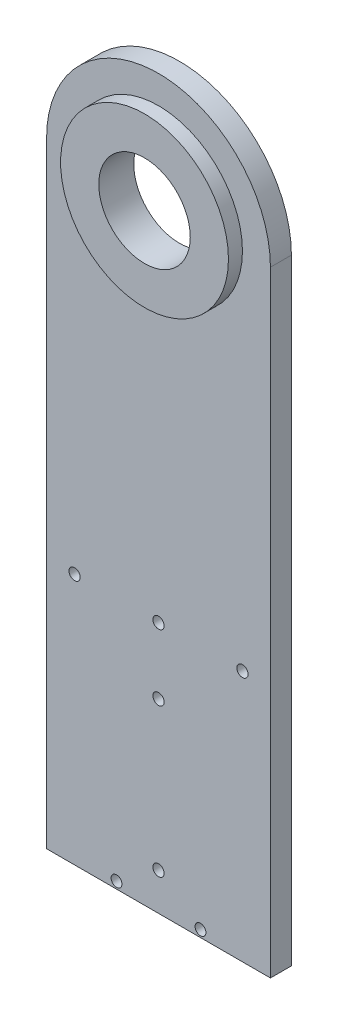
ISO-10303-21;
HEADER;
FILE_DESCRIPTION(('STEP AP214'),'2;1');
FILE_NAME('part.step','',(''),(''),'','','');
FILE_SCHEMA(('AUTOMOTIVE_DESIGN { 1 0 10303 214 1 1 1 1 }'));
ENDSEC;
DATA;
#1=APPLICATION_CONTEXT('core data for automotive mechanical design processes');
#2=APPLICATION_PROTOCOL_DEFINITION('international standard','automotive_design',2000,#1);
#3=PRODUCT_CONTEXT('',#1,'mechanical');
#4=PRODUCT('Part','Part','',(#3));
#5=PRODUCT_RELATED_PRODUCT_CATEGORY('part','',(#4));
#6=PRODUCT_DEFINITION_FORMATION('','',#4);
#7=PRODUCT_DEFINITION_CONTEXT('part definition',#1,'design');
#8=PRODUCT_DEFINITION('design','',#6,#7);
#9=PRODUCT_DEFINITION_SHAPE('','',#8);
#10=(LENGTH_UNIT() NAMED_UNIT(*) SI_UNIT(.MILLI.,.METRE.));
#11=(NAMED_UNIT(*) PLANE_ANGLE_UNIT() SI_UNIT($,.RADIAN.));
#12=(NAMED_UNIT(*) SI_UNIT($,.STERADIAN.) SOLID_ANGLE_UNIT());
#13=UNCERTAINTY_MEASURE_WITH_UNIT(LENGTH_MEASURE(1.E-05),#10,'distance_accuracy_value','');
#14=(GEOMETRIC_REPRESENTATION_CONTEXT(3) GLOBAL_UNCERTAINTY_ASSIGNED_CONTEXT((#13)) GLOBAL_UNIT_ASSIGNED_CONTEXT((#10,
#11,#12)) REPRESENTATION_CONTEXT('',''));
#15=CARTESIAN_POINT('',(0.,0.,0.));
#16=DIRECTION('',(0.,0.,1.));
#17=DIRECTION('',(1.,0.,0.));
#18=AXIS2_PLACEMENT_3D('',#15,#16,#17);
#19=CARTESIAN_POINT('',(0.,279.4,9.525));
#20=DIRECTION('',(0.,0.,1.));
#21=DIRECTION('',(1.,0.,0.));
#22=AXIS2_PLACEMENT_3D('',#19,#20,#21);
#23=PLANE('',#22);
#24=CARTESIAN_POINT('',(0.,84.30006,9.525));
#25=DIRECTION('',(0.,0.,1.));
#26=DIRECTION('',(1.,0.,0.));
#27=AXIS2_PLACEMENT_3D('',#24,#25,#26);
#28=CIRCLE('',#27,2.55269999999999);
#29=CARTESIAN_POINT('',(2.55269999999999,84.30006,9.525));
#30=VERTEX_POINT('',#29);
#31=EDGE_CURVE('E157',#30,#30,#28,.T.);
#32=ORIENTED_EDGE('',*,*,#31,.F.);
#33=EDGE_LOOP('',(#32));
#34=FACE_BOUND('',#33,.T.);
#35=CARTESIAN_POINT('',(0.,16.99006,9.525));
#36=DIRECTION('',(0.,0.,1.));
#37=DIRECTION('',(1.,0.,0.));
#38=AXIS2_PLACEMENT_3D('',#35,#36,#37);
#39=CIRCLE('',#38,2.55269999999999);
#40=CARTESIAN_POINT('',(2.55269999999999,16.99006,9.525));
#41=VERTEX_POINT('',#40);
#42=EDGE_CURVE('E151',#41,#41,#39,.T.);
#43=ORIENTED_EDGE('',*,*,#42,.F.);
#44=EDGE_LOOP('',(#43));
#45=FACE_BOUND('',#44,.T.);
#46=CARTESIAN_POINT('',(38.1,114.3,9.525));
#47=DIRECTION('',(0.,0.,1.));
#48=DIRECTION('',(1.,0.,0.));
#49=AXIS2_PLACEMENT_3D('',#46,#47,#48);
#50=CIRCLE('',#49,2.55269999999999);
#51=CARTESIAN_POINT('',(40.6527,114.3,9.525));
#52=VERTEX_POINT('',#51);
#53=EDGE_CURVE('E145',#52,#52,#50,.T.);
#54=ORIENTED_EDGE('',*,*,#53,.F.);
#55=EDGE_LOOP('',(#54));
#56=FACE_BOUND('',#55,.T.);
#57=CARTESIAN_POINT('',(0.,114.3,9.525));
#58=DIRECTION('',(0.,0.,1.));
#59=DIRECTION('',(1.,0.,0.));
#60=AXIS2_PLACEMENT_3D('',#57,#58,#59);
#61=CIRCLE('',#60,2.55269999999999);
#62=CARTESIAN_POINT('',(2.55269999999999,114.3,9.525));
#63=VERTEX_POINT('',#62);
#64=EDGE_CURVE('E139',#63,#63,#61,.T.);
#65=ORIENTED_EDGE('',*,*,#64,.F.);
#66=EDGE_LOOP('',(#65));
#67=FACE_BOUND('',#66,.T.);
#68=CARTESIAN_POINT('',(-38.1,114.3,9.525));
#69=DIRECTION('',(0.,0.,1.));
#70=DIRECTION('',(1.,0.,0.));
#71=AXIS2_PLACEMENT_3D('',#68,#69,#70);
#72=CIRCLE('',#71,2.55269999999999);
#73=CARTESIAN_POINT('',(-35.5473,114.3,9.525));
#74=VERTEX_POINT('',#73);
#75=EDGE_CURVE('E133',#74,#74,#72,.T.);
#76=ORIENTED_EDGE('',*,*,#75,.F.);
#77=EDGE_LOOP('',(#76));
#78=FACE_BOUND('',#77,.T.);
#79=CARTESIAN_POINT('',(19.05,3.175,9.525));
#80=DIRECTION('',(0.,0.,1.));
#81=DIRECTION('',(1.,0.,0.));
#82=AXIS2_PLACEMENT_3D('',#79,#80,#81);
#83=CIRCLE('',#82,2.45744999999999);
#84=CARTESIAN_POINT('',(21.50745,3.175,9.525));
#85=VERTEX_POINT('',#84);
#86=EDGE_CURVE('E127',#85,#85,#83,.T.);
#87=ORIENTED_EDGE('',*,*,#86,.F.);
#88=EDGE_LOOP('',(#87));
#89=FACE_BOUND('',#88,.T.);
#90=CARTESIAN_POINT('',(-19.05,3.175,9.525));
#91=DIRECTION('',(0.,0.,1.));
#92=DIRECTION('',(1.,0.,0.));
#93=AXIS2_PLACEMENT_3D('',#90,#91,#92);
#94=CIRCLE('',#93,2.45744999999999);
#95=CARTESIAN_POINT('',(-16.59255,3.175,9.525));
#96=VERTEX_POINT('',#95);
#97=EDGE_CURVE('E119',#96,#96,#94,.T.);
#98=ORIENTED_EDGE('',*,*,#97,.F.);
#99=EDGE_LOOP('',(#98));
#100=FACE_BOUND('',#99,.T.);
#101=DIRECTION('',(0.,-1.,0.));
#102=VECTOR('',#101,1.);
#103=CARTESIAN_POINT('',(-50.8,279.4,9.525));
#104=LINE('',#103,#102);
#105=CARTESIAN_POINT('',(-50.8,279.4,9.525));
#106=VERTEX_POINT('',#105);
#107=CARTESIAN_POINT('',(-50.8,0.,9.525));
#108=VERTEX_POINT('',#107);
#109=EDGE_CURVE('E84',#106,#108,#104,.T.);
#110=ORIENTED_EDGE('',*,*,#109,.T.);
#111=DIRECTION('',(1.,0.,0.));
#112=VECTOR('',#111,1.);
#113=CARTESIAN_POINT('',(-50.8,0.,9.525));
#114=LINE('',#113,#112);
#115=CARTESIAN_POINT('',(50.8,0.,9.525));
#116=VERTEX_POINT('',#115);
#117=EDGE_CURVE('E79',#108,#116,#114,.T.);
#118=ORIENTED_EDGE('',*,*,#117,.T.);
#119=DIRECTION('',(0.,1.,0.));
#120=VECTOR('',#119,1.);
#121=CARTESIAN_POINT('',(50.8,0.,9.525));
#122=LINE('',#121,#120);
#123=CARTESIAN_POINT('',(50.8,279.4,9.525));
#124=VERTEX_POINT('',#123);
#125=EDGE_CURVE('E82',#116,#124,#122,.T.);
#126=ORIENTED_EDGE('',*,*,#125,.T.);
#127=CARTESIAN_POINT('',(0.,279.4,9.525));
#128=DIRECTION('',(0.,0.,1.));
#129=DIRECTION('',(1.,0.,0.));
#130=AXIS2_PLACEMENT_3D('',#127,#128,#129);
#131=CIRCLE('',#130,50.8);
#132=EDGE_CURVE('E49',#124,#106,#131,.T.);
#133=ORIENTED_EDGE('',*,*,#132,.T.);
#134=EDGE_LOOP('',(#110,#118,#126,#133));
#135=FACE_BOUND('',#134,.T.);
#136=CARTESIAN_POINT('',(0.,279.4,9.525));
#137=DIRECTION('',(0.,0.,1.));
#138=DIRECTION('',(1.,0.,0.));
#139=AXIS2_PLACEMENT_3D('',#136,#137,#138);
#140=CIRCLE('',#139,38.1);
#141=CARTESIAN_POINT('',(38.1,279.4,9.525));
#142=VERTEX_POINT('',#141);
#143=EDGE_CURVE('E110',#142,#142,#140,.T.);
#144=ORIENTED_EDGE('',*,*,#143,.F.);
#145=EDGE_LOOP('',(#144));
#146=FACE_BOUND('',#145,.T.);
#147=ADVANCED_FACE('F32',(#34,#45,#56,#67,#78,#89,#100,#135,#146),#23,.T.);
#148=CARTESIAN_POINT('',(-50.8,279.4,9.525));
#149=DIRECTION('',(1.,0.,0.));
#150=DIRECTION('',(0.,0.,-1.));
#151=AXIS2_PLACEMENT_3D('',#148,#149,#150);
#152=PLANE('',#151);
#153=DIRECTION('',(0.,-1.,0.));
#154=VECTOR('',#153,1.);
#155=CARTESIAN_POINT('',(-50.8,279.4,0.));
#156=LINE('',#155,#154);
#157=CARTESIAN_POINT('',(-50.8,279.4,0.));
#158=VERTEX_POINT('',#157);
#159=CARTESIAN_POINT('',(-50.8,0.,0.));
#160=VERTEX_POINT('',#159);
#161=EDGE_CURVE('E96',#158,#160,#156,.T.);
#162=ORIENTED_EDGE('',*,*,#161,.T.);
#163=DIRECTION('',(0.,0.,-1.));
#164=VECTOR('',#163,1.);
#165=CARTESIAN_POINT('',(-50.8,0.,9.525));
#166=LINE('',#165,#164);
#167=EDGE_CURVE('E11',#108,#160,#166,.T.);
#168=ORIENTED_EDGE('',*,*,#167,.F.);
#169=ORIENTED_EDGE('',*,*,#109,.F.);
#170=DIRECTION('',(0.,0.,-1.));
#171=VECTOR('',#170,1.);
#172=CARTESIAN_POINT('',(-50.8,279.4,9.525));
#173=LINE('',#172,#171);
#174=EDGE_CURVE('E92',#106,#158,#173,.T.);
#175=ORIENTED_EDGE('',*,*,#174,.T.);
#176=EDGE_LOOP('',(#162,#168,#169,#175));
#177=FACE_BOUND('',#176,.T.);
#178=ADVANCED_FACE('F34',(#177),#152,.F.);
#179=CARTESIAN_POINT('',(-50.8,0.,9.525));
#180=DIRECTION('',(0.,1.,0.));
#181=DIRECTION('',(0.,0.,1.));
#182=AXIS2_PLACEMENT_3D('',#179,#180,#181);
#183=PLANE('',#182);
#184=DIRECTION('',(1.,0.,0.));
#185=VECTOR('',#184,1.);
#186=CARTESIAN_POINT('',(-50.8,0.,0.));
#187=LINE('',#186,#185);
#188=CARTESIAN_POINT('',(50.8,0.,0.));
#189=VERTEX_POINT('',#188);
#190=EDGE_CURVE('E88',#160,#189,#187,.T.);
#191=ORIENTED_EDGE('',*,*,#190,.T.);
#192=DIRECTION('',(0.,0.,-1.));
#193=VECTOR('',#192,1.);
#194=CARTESIAN_POINT('',(50.8,0.,9.525));
#195=LINE('',#194,#193);
#196=EDGE_CURVE('E41',#116,#189,#195,.T.);
#197=ORIENTED_EDGE('',*,*,#196,.F.);
#198=ORIENTED_EDGE('',*,*,#117,.F.);
#199=ORIENTED_EDGE('',*,*,#167,.T.);
#200=EDGE_LOOP('',(#191,#197,#198,#199));
#201=FACE_BOUND('',#200,.T.);
#202=ADVANCED_FACE('F87',(#201),#183,.F.);
#203=CARTESIAN_POINT('',(50.8,0.,9.525));
#204=DIRECTION('',(-1.,0.,0.));
#205=DIRECTION('',(0.,-1.,0.));
#206=AXIS2_PLACEMENT_3D('',#203,#204,#205);
#207=PLANE('',#206);
#208=DIRECTION('',(0.,1.,0.));
#209=VECTOR('',#208,1.);
#210=CARTESIAN_POINT('',(50.8,0.,0.));
#211=LINE('',#210,#209);
#212=CARTESIAN_POINT('',(50.8,279.4,0.));
#213=VERTEX_POINT('',#212);
#214=EDGE_CURVE('E66',#189,#213,#211,.T.);
#215=ORIENTED_EDGE('',*,*,#214,.T.);
#216=DIRECTION('',(0.,0.,-1.));
#217=VECTOR('',#216,1.);
#218=CARTESIAN_POINT('',(50.8,279.4,9.525));
#219=LINE('',#218,#217);
#220=EDGE_CURVE('E89',#124,#213,#219,.T.);
#221=ORIENTED_EDGE('',*,*,#220,.F.);
#222=ORIENTED_EDGE('',*,*,#125,.F.);
#223=ORIENTED_EDGE('',*,*,#196,.T.);
#224=EDGE_LOOP('',(#215,#221,#222,#223));
#225=FACE_BOUND('',#224,.T.);
#226=ADVANCED_FACE('F90',(#225),#207,.F.);
#227=CARTESIAN_POINT('',(0.,279.4,9.525));
#228=DIRECTION('',(0.,0.,-1.));
#229=DIRECTION('',(-1.,0.,0.));
#230=AXIS2_PLACEMENT_3D('',#227,#228,#229);
#231=CYLINDRICAL_SURFACE('',#230,50.8);
#232=CARTESIAN_POINT('',(0.,279.4,0.));
#233=DIRECTION('',(0.,0.,1.));
#234=DIRECTION('',(1.,0.,0.));
#235=AXIS2_PLACEMENT_3D('',#232,#233,#234);
#236=CIRCLE('',#235,50.8);
#237=EDGE_CURVE('E72',#213,#158,#236,.T.);
#238=ORIENTED_EDGE('',*,*,#237,.T.);
#239=ORIENTED_EDGE('',*,*,#174,.F.);
#240=ORIENTED_EDGE('',*,*,#132,.F.);
#241=ORIENTED_EDGE('',*,*,#220,.T.);
#242=EDGE_LOOP('',(#238,#239,#240,#241));
#243=FACE_BOUND('',#242,.T.);
#244=ADVANCED_FACE('F104',(#243),#231,.T.);
#245=CARTESIAN_POINT('',(0.,279.4,0.));
#246=DIRECTION('',(0.,0.,1.));
#247=DIRECTION('',(1.,0.,0.));
#248=AXIS2_PLACEMENT_3D('',#245,#246,#247);
#249=PLANE('',#248);
#250=CARTESIAN_POINT('',(0.,84.30006,0.));
#251=DIRECTION('',(0.,0.,-1.));
#252=DIRECTION('',(-1.,0.,0.));
#253=AXIS2_PLACEMENT_3D('',#250,#251,#252);
#254=CIRCLE('',#253,2.55269999999999);
#255=CARTESIAN_POINT('',(-2.55269999999999,84.30006,0.));
#256=VERTEX_POINT('',#255);
#257=EDGE_CURVE('E160',#256,#256,#254,.T.);
#258=ORIENTED_EDGE('',*,*,#257,.F.);
#259=EDGE_LOOP('',(#258));
#260=FACE_BOUND('',#259,.T.);
#261=CARTESIAN_POINT('',(0.,16.99006,0.));
#262=DIRECTION('',(0.,0.,-1.));
#263=DIRECTION('',(-1.,0.,0.));
#264=AXIS2_PLACEMENT_3D('',#261,#262,#263);
#265=CIRCLE('',#264,2.55269999999999);
#266=CARTESIAN_POINT('',(-2.55269999999999,16.99006,0.));
#267=VERTEX_POINT('',#266);
#268=EDGE_CURVE('E154',#267,#267,#265,.T.);
#269=ORIENTED_EDGE('',*,*,#268,.F.);
#270=EDGE_LOOP('',(#269));
#271=FACE_BOUND('',#270,.T.);
#272=CARTESIAN_POINT('',(38.1,114.3,0.));
#273=DIRECTION('',(0.,0.,-1.));
#274=DIRECTION('',(-1.,0.,0.));
#275=AXIS2_PLACEMENT_3D('',#272,#273,#274);
#276=CIRCLE('',#275,2.55269999999999);
#277=CARTESIAN_POINT('',(35.5473,114.3,0.));
#278=VERTEX_POINT('',#277);
#279=EDGE_CURVE('E148',#278,#278,#276,.T.);
#280=ORIENTED_EDGE('',*,*,#279,.F.);
#281=EDGE_LOOP('',(#280));
#282=FACE_BOUND('',#281,.T.);
#283=CARTESIAN_POINT('',(0.,114.3,0.));
#284=DIRECTION('',(0.,0.,-1.));
#285=DIRECTION('',(-1.,0.,0.));
#286=AXIS2_PLACEMENT_3D('',#283,#284,#285);
#287=CIRCLE('',#286,2.55269999999999);
#288=CARTESIAN_POINT('',(-2.55269999999999,114.3,0.));
#289=VERTEX_POINT('',#288);
#290=EDGE_CURVE('E142',#289,#289,#287,.T.);
#291=ORIENTED_EDGE('',*,*,#290,.F.);
#292=EDGE_LOOP('',(#291));
#293=FACE_BOUND('',#292,.T.);
#294=CARTESIAN_POINT('',(-38.1,114.3,0.));
#295=DIRECTION('',(0.,0.,-1.));
#296=DIRECTION('',(-1.,0.,0.));
#297=AXIS2_PLACEMENT_3D('',#294,#295,#296);
#298=CIRCLE('',#297,2.55269999999999);
#299=CARTESIAN_POINT('',(-40.6527,114.3,0.));
#300=VERTEX_POINT('',#299);
#301=EDGE_CURVE('E136',#300,#300,#298,.T.);
#302=ORIENTED_EDGE('',*,*,#301,.F.);
#303=EDGE_LOOP('',(#302));
#304=FACE_BOUND('',#303,.T.);
#305=CARTESIAN_POINT('',(19.05,3.175,0.));
#306=DIRECTION('',(0.,0.,-1.));
#307=DIRECTION('',(-1.,0.,0.));
#308=AXIS2_PLACEMENT_3D('',#305,#306,#307);
#309=CIRCLE('',#308,2.45744999999999);
#310=CARTESIAN_POINT('',(16.59255,3.175,0.));
#311=VERTEX_POINT('',#310);
#312=EDGE_CURVE('E130',#311,#311,#309,.T.);
#313=ORIENTED_EDGE('',*,*,#312,.F.);
#314=EDGE_LOOP('',(#313));
#315=FACE_BOUND('',#314,.T.);
#316=CARTESIAN_POINT('',(-19.05,3.175,0.));
#317=DIRECTION('',(0.,0.,-1.));
#318=DIRECTION('',(-1.,0.,0.));
#319=AXIS2_PLACEMENT_3D('',#316,#317,#318);
#320=CIRCLE('',#319,2.45744999999999);
#321=CARTESIAN_POINT('',(-21.50745,3.175,0.));
#322=VERTEX_POINT('',#321);
#323=EDGE_CURVE('E124',#322,#322,#320,.T.);
#324=ORIENTED_EDGE('',*,*,#323,.F.);
#325=EDGE_LOOP('',(#324));
#326=FACE_BOUND('',#325,.T.);
#327=CARTESIAN_POINT('',(0.,279.4,0.));
#328=DIRECTION('',(0.,0.,1.));
#329=DIRECTION('',(1.,0.,0.));
#330=AXIS2_PLACEMENT_3D('',#327,#328,#329);
#331=CIRCLE('',#330,20.7645);
#332=CARTESIAN_POINT('',(20.7645,279.4,0.));
#333=VERTEX_POINT('',#332);
#334=EDGE_CURVE('E113',#333,#333,#331,.T.);
#335=ORIENTED_EDGE('',*,*,#334,.T.);
#336=EDGE_LOOP('',(#335));
#337=FACE_BOUND('',#336,.T.);
#338=ORIENTED_EDGE('',*,*,#161,.F.);
#339=ORIENTED_EDGE('',*,*,#237,.F.);
#340=ORIENTED_EDGE('',*,*,#214,.F.);
#341=ORIENTED_EDGE('',*,*,#190,.F.);
#342=EDGE_LOOP('',(#338,#339,#340,#341));
#343=FACE_BOUND('',#342,.T.);
#344=ADVANCED_FACE('F107',(#260,#271,#282,#293,#304,#315,#326,#337,#343),#249,.F.);
#345=CARTESIAN_POINT('',(0.,279.4,15.875));
#346=DIRECTION('',(0.,0.,-1.));
#347=DIRECTION('',(-1.,0.,0.));
#348=AXIS2_PLACEMENT_3D('',#345,#346,#347);
#349=CYLINDRICAL_SURFACE('',#348,38.1);
#350=CARTESIAN_POINT('',(0.,279.4,15.875));
#351=DIRECTION('',(0.,0.,1.));
#352=DIRECTION('',(1.,0.,0.));
#353=AXIS2_PLACEMENT_3D('',#350,#351,#352);
#354=CIRCLE('',#353,38.1);
#355=CARTESIAN_POINT('',(38.1,279.4,15.875));
#356=VERTEX_POINT('',#355);
#357=EDGE_CURVE('E99',#356,#356,#354,.T.);
#358=ORIENTED_EDGE('',*,*,#357,.F.);
#359=EDGE_LOOP('',(#358));
#360=FACE_BOUND('',#359,.T.);
#361=ORIENTED_EDGE('',*,*,#143,.T.);
#362=EDGE_LOOP('',(#361));
#363=FACE_BOUND('',#362,.T.);
#364=ADVANCED_FACE('F168',(#360,#363),#349,.T.);
#365=CARTESIAN_POINT('',(0.,279.4,15.875));
#366=DIRECTION('',(0.,0.,1.));
#367=DIRECTION('',(1.,0.,0.));
#368=AXIS2_PLACEMENT_3D('',#365,#366,#367);
#369=PLANE('',#368);
#370=CARTESIAN_POINT('',(0.,279.4,15.875));
#371=DIRECTION('',(0.,0.,1.));
#372=DIRECTION('',(1.,0.,0.));
#373=AXIS2_PLACEMENT_3D('',#370,#371,#372);
#374=CIRCLE('',#373,20.7645);
#375=CARTESIAN_POINT('',(20.7645,279.4,15.875));
#376=VERTEX_POINT('',#375);
#377=EDGE_CURVE('E116',#376,#376,#374,.T.);
#378=ORIENTED_EDGE('',*,*,#377,.F.);
#379=EDGE_LOOP('',(#378));
#380=FACE_BOUND('',#379,.T.);
#381=ORIENTED_EDGE('',*,*,#357,.T.);
#382=EDGE_LOOP('',(#381));
#383=FACE_BOUND('',#382,.T.);
#384=ADVANCED_FACE('F188',(#380,#383),#369,.T.);
#385=CARTESIAN_POINT('',(0.,279.4,0.));
#386=DIRECTION('',(0.,0.,1.));
#387=DIRECTION('',(1.,0.,0.));
#388=AXIS2_PLACEMENT_3D('',#385,#386,#387);
#389=CYLINDRICAL_SURFACE('',#388,20.7645);
#390=ORIENTED_EDGE('',*,*,#334,.F.);
#391=EDGE_LOOP('',(#390));
#392=FACE_BOUND('',#391,.T.);
#393=ORIENTED_EDGE('',*,*,#377,.T.);
#394=EDGE_LOOP('',(#393));
#395=FACE_BOUND('',#394,.T.);
#396=ADVANCED_FACE('F184',(#392,#395),#389,.F.);
#397=CARTESIAN_POINT('',(-19.05,3.175,0.));
#398=DIRECTION('',(0.,0.,-1.));
#399=DIRECTION('',(-1.,0.,0.));
#400=AXIS2_PLACEMENT_3D('',#397,#398,#399);
#401=CYLINDRICAL_SURFACE('',#400,2.45744999999999);
#402=ORIENTED_EDGE('',*,*,#97,.T.);
#403=EDGE_LOOP('',(#402));
#404=FACE_BOUND('',#403,.T.);
#405=ORIENTED_EDGE('',*,*,#323,.T.);
#406=EDGE_LOOP('',(#405));
#407=FACE_BOUND('',#406,.T.);
#408=ADVANCED_FACE('F187',(#404,#407),#401,.F.);
#409=CARTESIAN_POINT('',(19.05,3.175,0.));
#410=DIRECTION('',(0.,0.,-1.));
#411=DIRECTION('',(-1.,0.,0.));
#412=AXIS2_PLACEMENT_3D('',#409,#410,#411);
#413=CYLINDRICAL_SURFACE('',#412,2.45744999999999);
#414=ORIENTED_EDGE('',*,*,#86,.T.);
#415=EDGE_LOOP('',(#414));
#416=FACE_BOUND('',#415,.T.);
#417=ORIENTED_EDGE('',*,*,#312,.T.);
#418=EDGE_LOOP('',(#417));
#419=FACE_BOUND('',#418,.T.);
#420=ADVANCED_FACE('F249',(#416,#419),#413,.F.);
#421=CARTESIAN_POINT('',(-38.1,114.3,0.));
#422=DIRECTION('',(0.,0.,-1.));
#423=DIRECTION('',(-1.,0.,0.));
#424=AXIS2_PLACEMENT_3D('',#421,#422,#423);
#425=CYLINDRICAL_SURFACE('',#424,2.55269999999999);
#426=ORIENTED_EDGE('',*,*,#75,.T.);
#427=EDGE_LOOP('',(#426));
#428=FACE_BOUND('',#427,.T.);
#429=ORIENTED_EDGE('',*,*,#301,.T.);
#430=EDGE_LOOP('',(#429));
#431=FACE_BOUND('',#430,.T.);
#432=ADVANCED_FACE('F257',(#428,#431),#425,.F.);
#433=CARTESIAN_POINT('',(0.,114.3,0.));
#434=DIRECTION('',(0.,0.,-1.));
#435=DIRECTION('',(-1.,0.,0.));
#436=AXIS2_PLACEMENT_3D('',#433,#434,#435);
#437=CYLINDRICAL_SURFACE('',#436,2.55269999999999);
#438=ORIENTED_EDGE('',*,*,#64,.T.);
#439=EDGE_LOOP('',(#438));
#440=FACE_BOUND('',#439,.T.);
#441=ORIENTED_EDGE('',*,*,#290,.T.);
#442=EDGE_LOOP('',(#441));
#443=FACE_BOUND('',#442,.T.);
#444=ADVANCED_FACE('F264',(#440,#443),#437,.F.);
#445=CARTESIAN_POINT('',(38.1,114.3,0.));
#446=DIRECTION('',(0.,0.,-1.));
#447=DIRECTION('',(-1.,0.,0.));
#448=AXIS2_PLACEMENT_3D('',#445,#446,#447);
#449=CYLINDRICAL_SURFACE('',#448,2.55269999999999);
#450=ORIENTED_EDGE('',*,*,#53,.T.);
#451=EDGE_LOOP('',(#450));
#452=FACE_BOUND('',#451,.T.);
#453=ORIENTED_EDGE('',*,*,#279,.T.);
#454=EDGE_LOOP('',(#453));
#455=FACE_BOUND('',#454,.T.);
#456=ADVANCED_FACE('F272',(#452,#455),#449,.F.);
#457=CARTESIAN_POINT('',(0.,16.99006,0.));
#458=DIRECTION('',(0.,0.,-1.));
#459=DIRECTION('',(-1.,0.,0.));
#460=AXIS2_PLACEMENT_3D('',#457,#458,#459);
#461=CYLINDRICAL_SURFACE('',#460,2.55269999999999);
#462=ORIENTED_EDGE('',*,*,#42,.T.);
#463=EDGE_LOOP('',(#462));
#464=FACE_BOUND('',#463,.T.);
#465=ORIENTED_EDGE('',*,*,#268,.T.);
#466=EDGE_LOOP('',(#465));
#467=FACE_BOUND('',#466,.T.);
#468=ADVANCED_FACE('F280',(#464,#467),#461,.F.);
#469=CARTESIAN_POINT('',(0.,84.30006,0.));
#470=DIRECTION('',(0.,0.,-1.));
#471=DIRECTION('',(-1.,0.,0.));
#472=AXIS2_PLACEMENT_3D('',#469,#470,#471);
#473=CYLINDRICAL_SURFACE('',#472,2.55269999999999);
#474=ORIENTED_EDGE('',*,*,#31,.T.);
#475=EDGE_LOOP('',(#474));
#476=FACE_BOUND('',#475,.T.);
#477=ORIENTED_EDGE('',*,*,#257,.T.);
#478=EDGE_LOOP('',(#477));
#479=FACE_BOUND('',#478,.T.);
#480=ADVANCED_FACE('F164',(#476,#479),#473,.F.);
#481=CLOSED_SHELL('',(#147,#178,#202,#226,#244,#344,#364,#384,#396,#408,#420,#432,#444,#456,
#468,#480));
#482=MANIFOLD_SOLID_BREP('B2',#481);
#483=ADVANCED_BREP_SHAPE_REPRESENTATION('',(#18,#482),#14);
#484=SHAPE_DEFINITION_REPRESENTATION(#9,#483);
ENDSEC;
END-ISO-10303-21;
